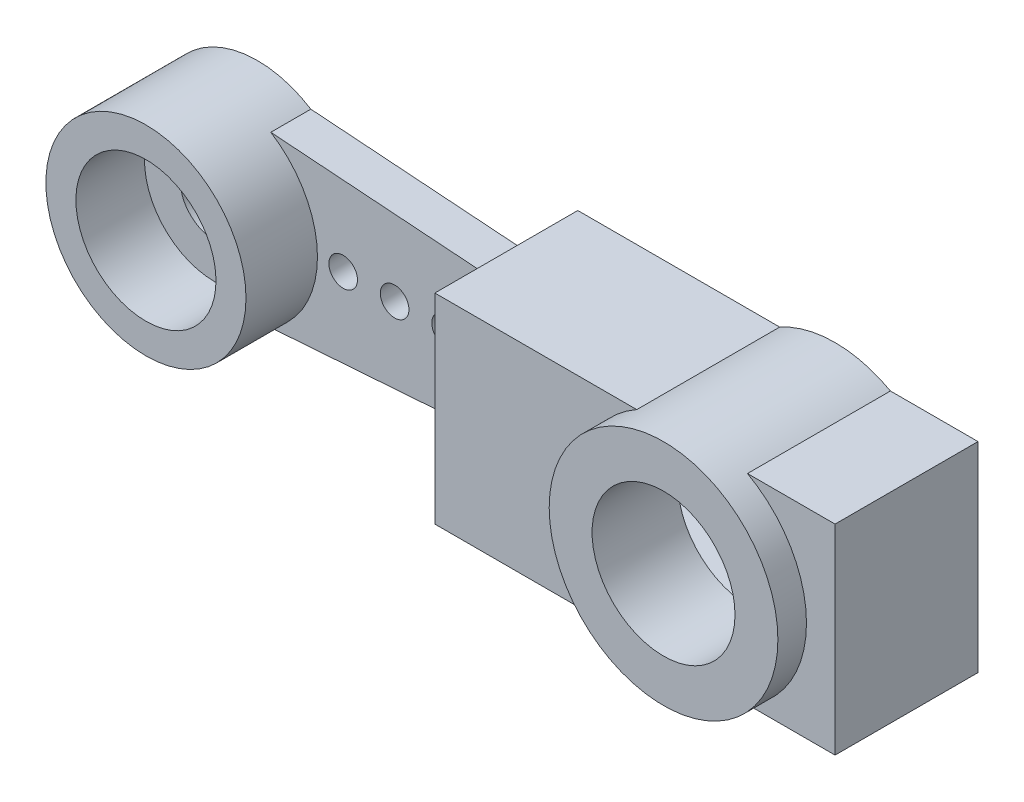
ISO-10303-21;
HEADER;
FILE_DESCRIPTION(('STEP AP214'),'2;1');
FILE_NAME('part.step','',(''),(''),'','','');
FILE_SCHEMA(('AUTOMOTIVE_DESIGN { 1 0 10303 214 1 1 1 1 }'));
ENDSEC;
DATA;
#1=APPLICATION_CONTEXT('core data for automotive mechanical design processes');
#2=APPLICATION_PROTOCOL_DEFINITION('international standard','automotive_design',2000,#1);
#3=PRODUCT_CONTEXT('',#1,'mechanical');
#4=PRODUCT('Part','Part','',(#3));
#5=PRODUCT_RELATED_PRODUCT_CATEGORY('part','',(#4));
#6=PRODUCT_DEFINITION_FORMATION('','',#4);
#7=PRODUCT_DEFINITION_CONTEXT('part definition',#1,'design');
#8=PRODUCT_DEFINITION('design','',#6,#7);
#9=PRODUCT_DEFINITION_SHAPE('','',#8);
#10=(LENGTH_UNIT() NAMED_UNIT(*) SI_UNIT(.MILLI.,.METRE.));
#11=(NAMED_UNIT(*) PLANE_ANGLE_UNIT() SI_UNIT($,.RADIAN.));
#12=(NAMED_UNIT(*) SI_UNIT($,.STERADIAN.) SOLID_ANGLE_UNIT());
#13=UNCERTAINTY_MEASURE_WITH_UNIT(LENGTH_MEASURE(1.E-05),#10,'distance_accuracy_value','');
#14=(GEOMETRIC_REPRESENTATION_CONTEXT(3) GLOBAL_UNCERTAINTY_ASSIGNED_CONTEXT((#13)) GLOBAL_UNIT_ASSIGNED_CONTEXT((#10,
#11,#12)) REPRESENTATION_CONTEXT('',''));
#15=CARTESIAN_POINT('',(0.,0.,0.));
#16=DIRECTION('',(0.,0.,1.));
#17=DIRECTION('',(1.,0.,0.));
#18=AXIS2_PLACEMENT_3D('',#15,#16,#17);
#19=CARTESIAN_POINT('',(13.5377556076663,7.66806747446083,7.8079032737814));
#20=DIRECTION('',(0.,0.,1.));
#21=DIRECTION('',(1.,0.,0.));
#22=AXIS2_PLACEMENT_3D('',#19,#20,#21);
#23=PLANE('',#22);
#24=DIRECTION('',(-1.,0.,0.));
#25=VECTOR('',#24,1.);
#26=CARTESIAN_POINT('',(13.5377556076663,5.16806747446083,7.8079032737814));
#27=LINE('',#26,#25);
#28=CARTESIAN_POINT('',(11.5377556076663,5.16806747446083,7.8079032737814));
#29=VERTEX_POINT('',#28);
#30=CARTESIAN_POINT('',(8.53775560766627,5.16806747446083,7.8079032737814));
#31=VERTEX_POINT('',#30);
#32=EDGE_CURVE('P0_E130',#29,#31,#27,.T.);
#33=ORIENTED_EDGE('',*,*,#32,.F.);
#34=DIRECTION('',(0.,1.,0.));
#35=VECTOR('',#34,1.);
#36=CARTESIAN_POINT('',(11.5377556076663,10.1680674744608,7.8079032737814));
#37=LINE('',#36,#35);
#38=CARTESIAN_POINT('',(11.5377556076663,10.1680674744608,7.8079032737814));
#39=VERTEX_POINT('',#38);
#40=EDGE_CURVE('P0_E129',#29,#39,#37,.T.);
#41=ORIENTED_EDGE('',*,*,#40,.T.);
#42=DIRECTION('',(-1.,0.,0.));
#43=VECTOR('',#42,1.);
#44=CARTESIAN_POINT('',(13.5377556076663,10.1680674744608,7.8079032737814));
#45=LINE('',#44,#43);
#46=CARTESIAN_POINT('',(8.53775560766627,10.1680674744608,7.8079032737814));
#47=VERTEX_POINT('',#46);
#48=EDGE_CURVE('P0_E116',#39,#47,#45,.T.);
#49=ORIENTED_EDGE('',*,*,#48,.T.);
#50=CARTESIAN_POINT('',(8.53775560766627,7.66806747446083,7.8079032737814));
#51=DIRECTION('',(0.,0.,-1.));
#52=DIRECTION('',(-1.,0.,0.));
#53=AXIS2_PLACEMENT_3D('',#50,#51,#52);
#54=CIRCLE('',#53,2.5);
#55=EDGE_CURVE('P0_E137',#31,#47,#54,.F.);
#56=ORIENTED_EDGE('',*,*,#55,.F.);
#57=EDGE_LOOP('',(#33,#41,#49,#56));
#58=FACE_BOUND('',#57,.T.);
#59=ADVANCED_FACE('P0_F16',(#58),#23,.T.);
#60=CARTESIAN_POINT('',(13.5377556076663,5.16806747446083,8.8079032737814));
#61=DIRECTION('',(0.,1.,0.));
#62=DIRECTION('',(0.,0.,1.));
#63=AXIS2_PLACEMENT_3D('',#60,#61,#62);
#64=PLANE('',#63);
#65=DIRECTION('',(-1.,0.,0.));
#66=VECTOR('',#65,1.);
#67=CARTESIAN_POINT('',(13.5377556076663,5.16806747446083,9.8079032737814));
#68=LINE('',#67,#66);
#69=CARTESIAN_POINT('',(11.5377556076663,5.16806747446083,9.8079032737814));
#70=VERTEX_POINT('',#69);
#71=CARTESIAN_POINT('',(8.53775560766627,5.16806747446083,9.8079032737814));
#72=VERTEX_POINT('',#71);
#73=EDGE_CURVE('P0_E217',#70,#72,#68,.T.);
#74=ORIENTED_EDGE('',*,*,#73,.F.);
#75=DIRECTION('',(0.,0.,-1.));
#76=VECTOR('',#75,1.);
#77=CARTESIAN_POINT('',(11.5377556076663,5.16806747446083,9.8079032737814));
#78=LINE('',#77,#76);
#79=EDGE_CURVE('P0_E30',#70,#29,#78,.T.);
#80=ORIENTED_EDGE('',*,*,#79,.T.);
#81=ORIENTED_EDGE('',*,*,#32,.T.);
#82=CARTESIAN_POINT('',(-0.46224439233373,5.16806747446083,7.8079032737814));
#83=VERTEX_POINT('',#82);
#84=EDGE_CURVE('P0_E219',#31,#83,#27,.T.);
#85=ORIENTED_EDGE('',*,*,#84,.T.);
#86=DIRECTION('',(0.,0.,-1.));
#87=VECTOR('',#86,1.);
#88=CARTESIAN_POINT('',(-0.46224439233373,5.16806747446083,8.8079032737814));
#89=LINE('',#88,#87);
#90=CARTESIAN_POINT('',(-0.46224439233373,5.16806747446083,9.8079032737814));
#91=VERTEX_POINT('',#90);
#92=EDGE_CURVE('P0_E178',#91,#83,#89,.T.);
#93=ORIENTED_EDGE('',*,*,#92,.F.);
#94=EDGE_CURVE('P0_E216',#72,#91,#68,.T.);
#95=ORIENTED_EDGE('',*,*,#94,.F.);
#96=EDGE_LOOP('',(#74,#80,#81,#85,#93,#95));
#97=FACE_BOUND('',#96,.T.);
#98=ADVANCED_FACE('P0_F274',(#97),#64,.T.);
#99=CARTESIAN_POINT('',(13.5377556076663,7.66806747446083,9.8079032737814));
#100=DIRECTION('',(0.,0.,1.));
#101=DIRECTION('',(1.,0.,0.));
#102=AXIS2_PLACEMENT_3D('',#99,#100,#101);
#103=PLANE('',#102);
#104=DIRECTION('',(0.,-1.,0.));
#105=VECTOR('',#104,1.);
#106=CARTESIAN_POINT('',(11.5377556076663,10.1680674744608,9.8079032737814));
#107=LINE('',#106,#105);
#108=CARTESIAN_POINT('',(11.5377556076663,10.1680674744608,9.8079032737814));
#109=VERTEX_POINT('',#108);
#110=EDGE_CURVE('P0_E38',#109,#70,#107,.T.);
#111=ORIENTED_EDGE('',*,*,#110,.T.);
#112=ORIENTED_EDGE('',*,*,#73,.T.);
#113=CARTESIAN_POINT('',(8.53775560766627,7.66806747446083,9.8079032737814));
#114=DIRECTION('',(0.,0.,1.));
#115=DIRECTION('',(1.,0.,0.));
#116=AXIS2_PLACEMENT_3D('',#113,#114,#115);
#117=CIRCLE('',#116,2.5);
#118=CARTESIAN_POINT('',(8.53775560766627,10.1680674744608,9.8079032737814));
#119=VERTEX_POINT('',#118);
#120=EDGE_CURVE('P0_E141',#119,#72,#117,.F.);
#121=ORIENTED_EDGE('',*,*,#120,.F.);
#122=DIRECTION('',(-1.,0.,0.));
#123=VECTOR('',#122,1.);
#124=CARTESIAN_POINT('',(13.5377556076663,10.1680674744608,9.8079032737814));
#125=LINE('',#124,#123);
#126=EDGE_CURVE('P0_E214',#109,#119,#125,.T.);
#127=ORIENTED_EDGE('',*,*,#126,.F.);
#128=EDGE_LOOP('',(#111,#112,#121,#127));
#129=FACE_BOUND('',#128,.T.);
#130=ADVANCED_FACE('P0_F279',(#129),#103,.F.);
#131=CARTESIAN_POINT('',(13.5377556076663,10.1680674744608,8.8079032737814));
#132=DIRECTION('',(0.,1.,0.));
#133=DIRECTION('',(0.,0.,1.));
#134=AXIS2_PLACEMENT_3D('',#131,#132,#133);
#135=PLANE('',#134);
#136=DIRECTION('',(0.,0.,1.));
#137=VECTOR('',#136,1.);
#138=CARTESIAN_POINT('',(11.5377556076663,10.1680674744608,9.8079032737814));
#139=LINE('',#138,#137);
#140=EDGE_CURVE('P0_E120',#39,#109,#139,.T.);
#141=ORIENTED_EDGE('',*,*,#140,.T.);
#142=ORIENTED_EDGE('',*,*,#126,.T.);
#143=CARTESIAN_POINT('',(-0.46224439233373,10.1680674744608,9.8079032737814));
#144=VERTEX_POINT('',#143);
#145=EDGE_CURVE('P0_E126',#119,#144,#125,.T.);
#146=ORIENTED_EDGE('',*,*,#145,.T.);
#147=DIRECTION('',(0.,0.,-1.));
#148=VECTOR('',#147,1.);
#149=CARTESIAN_POINT('',(-0.46224439233373,10.1680674744608,8.8079032737814));
#150=LINE('',#149,#148);
#151=CARTESIAN_POINT('',(-0.46224439233373,10.1680674744608,7.8079032737814));
#152=VERTEX_POINT('',#151);
#153=EDGE_CURVE('P0_E184',#144,#152,#150,.T.);
#154=ORIENTED_EDGE('',*,*,#153,.T.);
#155=EDGE_CURVE('P0_E122',#47,#152,#45,.T.);
#156=ORIENTED_EDGE('',*,*,#155,.F.);
#157=ORIENTED_EDGE('',*,*,#48,.F.);
#158=EDGE_LOOP('',(#141,#142,#146,#154,#156,#157));
#159=FACE_BOUND('',#158,.T.);
#160=ADVANCED_FACE('P0_F118',(#159),#135,.F.);
#161=CARTESIAN_POINT('',(8.53775560766627,7.66806747446083,-2.1920967262186));
#162=DIRECTION('',(0.,0.,1.));
#163=DIRECTION('',(1.,0.,0.));
#164=AXIS2_PLACEMENT_3D('',#161,#162,#163);
#165=CYLINDRICAL_SURFACE('',#164,2.5);
#166=EDGE_CURVE('P0_E134',#47,#31,#54,.F.);
#167=ORIENTED_EDGE('',*,*,#166,.T.);
#168=ORIENTED_EDGE('',*,*,#55,.T.);
#169=EDGE_LOOP('',(#167,#168));
#170=FACE_BOUND('',#169,.T.);
#171=CARTESIAN_POINT('',(8.53775560766627,7.66806747446083,7.3079032737814));
#172=DIRECTION('',(0.,0.,-1.));
#173=DIRECTION('',(-1.,0.,0.));
#174=AXIS2_PLACEMENT_3D('',#171,#172,#173);
#175=CIRCLE('',#174,2.5);
#176=CARTESIAN_POINT('',(6.03775560766627,7.66806747446083,7.3079032737814));
#177=VERTEX_POINT('',#176);
#178=EDGE_CURVE('P0_E11',#177,#177,#175,.F.);
#179=ORIENTED_EDGE('',*,*,#178,.F.);
#180=EDGE_LOOP('',(#179));
#181=FACE_BOUND('',#180,.T.);
#182=ADVANCED_FACE('P0_F294',(#170,#181),#165,.F.);
#183=CARTESIAN_POINT('',(8.53775560766627,7.66806747446083,12.8079032737814));
#184=DIRECTION('',(0.,0.,1.));
#185=DIRECTION('',(1.,0.,0.));
#186=AXIS2_PLACEMENT_3D('',#183,#184,#185);
#187=CIRCLE('',#186,2.5);
#188=CARTESIAN_POINT('',(11.0377556076663,7.66806747446083,12.8079032737814));
#189=VERTEX_POINT('',#188);
#190=EDGE_CURVE('P0_E145',#189,#189,#187,.T.);
#191=ORIENTED_EDGE('',*,*,#190,.T.);
#192=EDGE_LOOP('',(#191));
#193=FACE_BOUND('',#192,.T.);
#194=ORIENTED_EDGE('',*,*,#120,.T.);
#195=EDGE_CURVE('P0_E144',#72,#119,#117,.F.);
#196=ORIENTED_EDGE('',*,*,#195,.T.);
#197=EDGE_LOOP('',(#194,#196));
#198=FACE_BOUND('',#197,.T.);
#199=ADVANCED_FACE('P0_F297',(#193,#198),#165,.F.);
#200=CARTESIAN_POINT('',(13.5377556076663,4.16806747446083,8.8079032737814));
#201=DIRECTION('',(0.,1.,0.));
#202=DIRECTION('',(0.,0.,1.));
#203=AXIS2_PLACEMENT_3D('',#200,#201,#202);
#204=PLANE('',#203);
#205=DIRECTION('',(-1.,0.,0.));
#206=VECTOR('',#205,1.);
#207=CARTESIAN_POINT('',(13.5377556076663,4.16806747446083,6.8079032737814));
#208=LINE('',#207,#206);
#209=CARTESIAN_POINT('',(6.60126393456256,4.16806747446083,6.8079032737814));
#210=VERTEX_POINT('',#209);
#211=CARTESIAN_POINT('',(-0.46224439233373,4.16806747446083,6.8079032737814));
#212=VERTEX_POINT('',#211);
#213=EDGE_CURVE('P0_E209',#210,#212,#208,.T.);
#214=ORIENTED_EDGE('',*,*,#213,.F.);
#215=DIRECTION('',(0.,0.,1.));
#216=VECTOR('',#215,1.);
#217=CARTESIAN_POINT('',(6.60126393456256,4.16806747446083,6.8079032737814));
#218=LINE('',#217,#216);
#219=CARTESIAN_POINT('',(6.60126393456256,4.16806747446083,11.8079032737814));
#220=VERTEX_POINT('',#219);
#221=EDGE_CURVE('P0_E156',#210,#220,#218,.T.);
#222=ORIENTED_EDGE('',*,*,#221,.T.);
#223=DIRECTION('',(-1.,0.,0.));
#224=VECTOR('',#223,1.);
#225=CARTESIAN_POINT('',(13.5377556076663,4.16806747446083,11.8079032737814));
#226=LINE('',#225,#224);
#227=CARTESIAN_POINT('',(-0.46224439233373,4.16806747446083,11.8079032737814));
#228=VERTEX_POINT('',#227);
#229=EDGE_CURVE('P0_E201',#220,#228,#226,.T.);
#230=ORIENTED_EDGE('',*,*,#229,.T.);
#231=DIRECTION('',(0.,0.,-1.));
#232=VECTOR('',#231,1.);
#233=CARTESIAN_POINT('',(-0.46224439233373,4.16806747446083,8.8079032737814));
#234=LINE('',#233,#232);
#235=EDGE_CURVE('P0_E186',#228,#212,#234,.T.);
#236=ORIENTED_EDGE('',*,*,#235,.T.);
#237=EDGE_LOOP('',(#214,#222,#230,#236));
#238=FACE_BOUND('',#237,.T.);
#239=ADVANCED_FACE('P0_F254',(#238),#204,.F.);
#240=CARTESIAN_POINT('',(13.5377556076663,11.1680674744608,8.8079032737814));
#241=DIRECTION('',(0.,1.,0.));
#242=DIRECTION('',(0.,0.,1.));
#243=AXIS2_PLACEMENT_3D('',#240,#241,#242);
#244=PLANE('',#243);
#245=DIRECTION('',(0.,0.,1.));
#246=VECTOR('',#245,1.);
#247=CARTESIAN_POINT('',(6.60126393456256,11.1680674744608,6.8079032737814));
#248=LINE('',#247,#246);
#249=CARTESIAN_POINT('',(6.60126393456256,11.1680674744608,6.8079032737814));
#250=VERTEX_POINT('',#249);
#251=CARTESIAN_POINT('',(6.60126393456256,11.1680674744608,11.8079032737814));
#252=VERTEX_POINT('',#251);
#253=EDGE_CURVE('P0_E154',#250,#252,#248,.T.);
#254=ORIENTED_EDGE('',*,*,#253,.F.);
#255=DIRECTION('',(-1.,0.,0.));
#256=VECTOR('',#255,1.);
#257=CARTESIAN_POINT('',(13.5377556076663,11.1680674744608,6.8079032737814));
#258=LINE('',#257,#256);
#259=CARTESIAN_POINT('',(-0.46224439233373,11.1680674744608,6.8079032737814));
#260=VERTEX_POINT('',#259);
#261=EDGE_CURVE('P0_E205',#250,#260,#258,.T.);
#262=ORIENTED_EDGE('',*,*,#261,.T.);
#263=DIRECTION('',(0.,0.,-1.));
#264=VECTOR('',#263,1.);
#265=CARTESIAN_POINT('',(-0.46224439233373,11.1680674744608,8.8079032737814));
#266=LINE('',#265,#264);
#267=CARTESIAN_POINT('',(-0.46224439233373,11.1680674744608,11.8079032737814));
#268=VERTEX_POINT('',#267);
#269=EDGE_CURVE('P0_E192',#268,#260,#266,.T.);
#270=ORIENTED_EDGE('',*,*,#269,.F.);
#271=DIRECTION('',(-1.,0.,0.));
#272=VECTOR('',#271,1.);
#273=CARTESIAN_POINT('',(13.5377556076663,11.1680674744608,11.8079032737814));
#274=LINE('',#273,#272);
#275=EDGE_CURVE('P0_E200',#252,#268,#274,.T.);
#276=ORIENTED_EDGE('',*,*,#275,.F.);
#277=EDGE_LOOP('',(#254,#262,#270,#276));
#278=FACE_BOUND('',#277,.T.);
#279=ADVANCED_FACE('P0_F250',(#278),#244,.T.);
#280=CARTESIAN_POINT('',(13.5377556076663,7.66806747446083,11.8079032737814));
#281=DIRECTION('',(0.,0.,-1.));
#282=DIRECTION('',(0.,1.,0.));
#283=AXIS2_PLACEMENT_3D('',#280,#281,#282);
#284=PLANE('',#283);
#285=CARTESIAN_POINT('',(13.5377556076663,11.1680674744608,11.8079032737814));
#286=VERTEX_POINT('',#285);
#287=CARTESIAN_POINT('',(10.47424728077,11.1680674744608,11.8079032737814));
#288=VERTEX_POINT('',#287);
#289=EDGE_CURVE('P0_E202',#286,#288,#274,.T.);
#290=ORIENTED_EDGE('',*,*,#289,.T.);
#291=CARTESIAN_POINT('',(8.53775560766627,7.66806747446083,11.8079032737814));
#292=DIRECTION('',(0.,0.,-1.));
#293=DIRECTION('',(0.,1.,0.));
#294=AXIS2_PLACEMENT_3D('',#291,#292,#293);
#295=CIRCLE('',#294,4.);
#296=CARTESIAN_POINT('',(10.47424728077,4.16806747446083,11.8079032737814));
#297=VERTEX_POINT('',#296);
#298=EDGE_CURVE('P0_E23',#288,#297,#295,.T.);
#299=ORIENTED_EDGE('',*,*,#298,.T.);
#300=CARTESIAN_POINT('',(13.5377556076663,4.16806747446083,11.8079032737814));
#301=VERTEX_POINT('',#300);
#302=EDGE_CURVE('P0_E197',#301,#297,#226,.T.);
#303=ORIENTED_EDGE('',*,*,#302,.F.);
#304=DIRECTION('',(0.,-1.,0.));
#305=VECTOR('',#304,1.);
#306=CARTESIAN_POINT('',(13.5377556076663,7.66806747446083,11.8079032737814));
#307=LINE('',#306,#305);
#308=EDGE_CURVE('P0_E174',#286,#301,#307,.T.);
#309=ORIENTED_EDGE('',*,*,#308,.F.);
#310=EDGE_LOOP('',(#290,#299,#303,#309));
#311=FACE_BOUND('',#310,.T.);
#312=ADVANCED_FACE('P0_F227',(#311),#284,.F.);
#313=ORIENTED_EDGE('',*,*,#84,.F.);
#314=ORIENTED_EDGE('',*,*,#166,.F.);
#315=ORIENTED_EDGE('',*,*,#155,.T.);
#316=DIRECTION('',(0.,1.,0.));
#317=VECTOR('',#316,1.);
#318=CARTESIAN_POINT('',(-0.46224439233373,7.66806747446083,7.8079032737814));
#319=LINE('',#318,#317);
#320=EDGE_CURVE('P0_E164',#83,#152,#319,.T.);
#321=ORIENTED_EDGE('',*,*,#320,.F.);
#322=EDGE_LOOP('',(#313,#314,#315,#321));
#323=FACE_BOUND('',#322,.T.);
#324=ADVANCED_FACE('P0_F275',(#323),#23,.T.);
#325=ORIENTED_EDGE('',*,*,#145,.F.);
#326=ORIENTED_EDGE('',*,*,#195,.F.);
#327=ORIENTED_EDGE('',*,*,#94,.T.);
#328=DIRECTION('',(0.,1.,0.));
#329=VECTOR('',#328,1.);
#330=CARTESIAN_POINT('',(-0.46224439233373,7.66806747446083,9.8079032737814));
#331=LINE('',#330,#329);
#332=EDGE_CURVE('P0_E181',#91,#144,#331,.T.);
#333=ORIENTED_EDGE('',*,*,#332,.T.);
#334=EDGE_LOOP('',(#325,#326,#327,#333));
#335=FACE_BOUND('',#334,.T.);
#336=ADVANCED_FACE('P0_F281',(#335),#103,.F.);
#337=ORIENTED_EDGE('',*,*,#302,.T.);
#338=DIRECTION('',(0.,0.,1.));
#339=VECTOR('',#338,1.);
#340=CARTESIAN_POINT('',(10.47424728077,4.16806747446083,6.8079032737814));
#341=LINE('',#340,#339);
#342=CARTESIAN_POINT('',(10.47424728077,4.16806747446083,6.8079032737814));
#343=VERTEX_POINT('',#342);
#344=EDGE_CURVE('P0_E161',#297,#343,#341,.F.);
#345=ORIENTED_EDGE('',*,*,#344,.T.);
#346=CARTESIAN_POINT('',(13.5377556076663,4.16806747446083,6.8079032737814));
#347=VERTEX_POINT('',#346);
#348=EDGE_CURVE('P0_E210',#347,#343,#208,.T.);
#349=ORIENTED_EDGE('',*,*,#348,.F.);
#350=DIRECTION('',(0.,0.,-1.));
#351=VECTOR('',#350,1.);
#352=CARTESIAN_POINT('',(13.5377556076663,4.16806747446083,8.8079032737814));
#353=LINE('',#352,#351);
#354=EDGE_CURVE('P0_E165',#301,#347,#353,.T.);
#355=ORIENTED_EDGE('',*,*,#354,.F.);
#356=EDGE_LOOP('',(#337,#345,#349,#355));
#357=FACE_BOUND('',#356,.T.);
#358=ADVANCED_FACE('P0_F233',(#357),#204,.F.);
#359=CARTESIAN_POINT('',(13.5377556076663,7.66806747446083,6.8079032737814));
#360=DIRECTION('',(0.,0.,1.));
#361=DIRECTION('',(1.,0.,0.));
#362=AXIS2_PLACEMENT_3D('',#359,#360,#361);
#363=PLANE('',#362);
#364=ORIENTED_EDGE('',*,*,#348,.T.);
#365=CARTESIAN_POINT('',(8.53775560766627,7.66806747446083,6.8079032737814));
#366=DIRECTION('',(0.,0.,1.));
#367=DIRECTION('',(1.,0.,0.));
#368=AXIS2_PLACEMENT_3D('',#365,#366,#367);
#369=CIRCLE('',#368,4.);
#370=EDGE_CURVE('P0_E151',#210,#343,#369,.T.);
#371=ORIENTED_EDGE('',*,*,#370,.F.);
#372=ORIENTED_EDGE('',*,*,#213,.T.);
#373=DIRECTION('',(0.,1.,0.));
#374=VECTOR('',#373,1.);
#375=CARTESIAN_POINT('',(-0.46224439233373,7.66806747446083,6.8079032737814));
#376=LINE('',#375,#374);
#377=EDGE_CURVE('P0_E189',#212,#260,#376,.T.);
#378=ORIENTED_EDGE('',*,*,#377,.T.);
#379=ORIENTED_EDGE('',*,*,#261,.F.);
#380=CARTESIAN_POINT('',(10.47424728077,11.1680674744608,6.8079032737814));
#381=VERTEX_POINT('',#380);
#382=EDGE_CURVE('P0_E152',#381,#250,#369,.T.);
#383=ORIENTED_EDGE('',*,*,#382,.F.);
#384=CARTESIAN_POINT('',(13.5377556076663,11.1680674744608,6.8079032737814));
#385=VERTEX_POINT('',#384);
#386=EDGE_CURVE('P0_E206',#385,#381,#258,.T.);
#387=ORIENTED_EDGE('',*,*,#386,.F.);
#388=DIRECTION('',(0.,1.,0.));
#389=VECTOR('',#388,1.);
#390=CARTESIAN_POINT('',(13.5377556076663,7.66806747446083,6.8079032737814));
#391=LINE('',#390,#389);
#392=EDGE_CURVE('P0_E168',#347,#385,#391,.T.);
#393=ORIENTED_EDGE('',*,*,#392,.F.);
#394=EDGE_LOOP('',(#364,#371,#372,#378,#379,#383,#387,#393));
#395=FACE_BOUND('',#394,.T.);
#396=ADVANCED_FACE('P0_F246',(#395),#363,.F.);
#397=DIRECTION('',(0.,0.,1.));
#398=VECTOR('',#397,1.);
#399=CARTESIAN_POINT('',(10.47424728077,11.1680674744608,6.8079032737814));
#400=LINE('',#399,#398);
#401=EDGE_CURVE('P0_E159',#288,#381,#400,.F.);
#402=ORIENTED_EDGE('',*,*,#401,.F.);
#403=ORIENTED_EDGE('',*,*,#289,.F.);
#404=DIRECTION('',(0.,0.,-1.));
#405=VECTOR('',#404,1.);
#406=CARTESIAN_POINT('',(13.5377556076663,11.1680674744608,8.8079032737814));
#407=LINE('',#406,#405);
#408=EDGE_CURVE('P0_E171',#286,#385,#407,.T.);
#409=ORIENTED_EDGE('',*,*,#408,.T.);
#410=ORIENTED_EDGE('',*,*,#386,.T.);
#411=EDGE_LOOP('',(#402,#403,#409,#410));
#412=FACE_BOUND('',#411,.T.);
#413=ADVANCED_FACE('P0_F240',(#412),#244,.T.);
#414=ORIENTED_EDGE('',*,*,#229,.F.);
#415=EDGE_CURVE('P0_E212',#220,#252,#295,.T.);
#416=ORIENTED_EDGE('',*,*,#415,.T.);
#417=ORIENTED_EDGE('',*,*,#275,.T.);
#418=DIRECTION('',(0.,-1.,0.));
#419=VECTOR('',#418,1.);
#420=CARTESIAN_POINT('',(-0.46224439233373,7.66806747446083,11.8079032737814));
#421=LINE('',#420,#419);
#422=EDGE_CURVE('P0_E169',#268,#228,#421,.T.);
#423=ORIENTED_EDGE('',*,*,#422,.T.);
#424=EDGE_LOOP('',(#414,#416,#417,#423));
#425=FACE_BOUND('',#424,.T.);
#426=ADVANCED_FACE('P0_F255',(#425),#284,.F.);
#427=CARTESIAN_POINT('',(13.5377556076663,7.66806747446083,8.8079032737814));
#428=DIRECTION('',(1.,0.,0.));
#429=DIRECTION('',(0.,0.,-1.));
#430=AXIS2_PLACEMENT_3D('',#427,#428,#429);
#431=PLANE('',#430);
#432=ORIENTED_EDGE('',*,*,#354,.T.);
#433=ORIENTED_EDGE('',*,*,#392,.T.);
#434=ORIENTED_EDGE('',*,*,#408,.F.);
#435=ORIENTED_EDGE('',*,*,#308,.T.);
#436=EDGE_LOOP('',(#432,#433,#434,#435));
#437=FACE_BOUND('',#436,.T.);
#438=ADVANCED_FACE('P0_F236',(#437),#431,.T.);
#439=CARTESIAN_POINT('',(-0.46224439233373,7.66806747446083,8.8079032737814));
#440=DIRECTION('',(1.,0.,0.));
#441=DIRECTION('',(0.,0.,-1.));
#442=AXIS2_PLACEMENT_3D('',#439,#440,#441);
#443=PLANE('',#442);
#444=ORIENTED_EDGE('',*,*,#320,.T.);
#445=ORIENTED_EDGE('',*,*,#153,.F.);
#446=ORIENTED_EDGE('',*,*,#332,.F.);
#447=ORIENTED_EDGE('',*,*,#92,.T.);
#448=EDGE_LOOP('',(#444,#445,#446,#447));
#449=FACE_BOUND('',#448,.T.);
#450=ORIENTED_EDGE('',*,*,#235,.F.);
#451=ORIENTED_EDGE('',*,*,#422,.F.);
#452=ORIENTED_EDGE('',*,*,#269,.T.);
#453=ORIENTED_EDGE('',*,*,#377,.F.);
#454=EDGE_LOOP('',(#450,#451,#452,#453));
#455=FACE_BOUND('',#454,.T.);
#456=ADVANCED_FACE('P0_F259',(#449,#455),#443,.F.);
#457=CARTESIAN_POINT('',(8.53775560766627,7.66806747446083,12.8079032737814));
#458=DIRECTION('',(0.,0.,1.));
#459=DIRECTION('',(1.,0.,0.));
#460=AXIS2_PLACEMENT_3D('',#457,#458,#459);
#461=PLANE('',#460);
#462=CARTESIAN_POINT('',(8.53775560766627,7.66806747446083,12.8079032737814));
#463=DIRECTION('',(0.,0.,1.));
#464=DIRECTION('',(1.,0.,0.));
#465=AXIS2_PLACEMENT_3D('',#462,#463,#464);
#466=CIRCLE('',#465,4.);
#467=CARTESIAN_POINT('',(12.5377556076663,7.66806747446083,12.8079032737814));
#468=VERTEX_POINT('',#467);
#469=EDGE_CURVE('P0_E148',#468,#468,#466,.T.);
#470=ORIENTED_EDGE('',*,*,#469,.T.);
#471=EDGE_LOOP('',(#470));
#472=FACE_BOUND('',#471,.T.);
#473=ORIENTED_EDGE('',*,*,#190,.F.);
#474=EDGE_LOOP('',(#473));
#475=FACE_BOUND('',#474,.T.);
#476=ADVANCED_FACE('P0_F261',(#472,#475),#461,.T.);
#477=CARTESIAN_POINT('',(8.53775560766627,7.66806747446083,6.8079032737814));
#478=DIRECTION('',(0.,0.,1.));
#479=DIRECTION('',(1.,0.,0.));
#480=AXIS2_PLACEMENT_3D('',#477,#478,#479);
#481=CYLINDRICAL_SURFACE('',#480,4.);
#482=ORIENTED_EDGE('',*,*,#469,.F.);
#483=EDGE_LOOP('',(#482));
#484=FACE_BOUND('',#483,.T.);
#485=ORIENTED_EDGE('',*,*,#344,.F.);
#486=ORIENTED_EDGE('',*,*,#298,.F.);
#487=ORIENTED_EDGE('',*,*,#401,.T.);
#488=ORIENTED_EDGE('',*,*,#382,.T.);
#489=ORIENTED_EDGE('',*,*,#253,.T.);
#490=ORIENTED_EDGE('',*,*,#415,.F.);
#491=ORIENTED_EDGE('',*,*,#221,.F.);
#492=ORIENTED_EDGE('',*,*,#370,.T.);
#493=EDGE_LOOP('',(#485,#486,#487,#488,#489,#490,#491,#492));
#494=FACE_BOUND('',#493,.T.);
#495=ADVANCED_FACE('P0_F242',(#484,#494),#481,.T.);
#496=CARTESIAN_POINT('',(-0.46224439233373,7.66806747446083,7.3079032737814));
#497=DIRECTION('',(0.,0.,-1.));
#498=DIRECTION('',(-1.,0.,0.));
#499=AXIS2_PLACEMENT_3D('',#496,#497,#498);
#500=PLANE('',#499);
#501=ORIENTED_EDGE('',*,*,#178,.T.);
#502=EDGE_LOOP('',(#501));
#503=FACE_BOUND('',#502,.T.);
#504=ADVANCED_FACE('P0_F301',(#503),#500,.F.);
#505=CARTESIAN_POINT('',(11.5377556076663,7.66806747446083,8.8079032737814));
#506=DIRECTION('',(1.,0.,0.));
#507=DIRECTION('',(0.,0.,-1.));
#508=AXIS2_PLACEMENT_3D('',#505,#506,#507);
#509=PLANE('',#508);
#510=ORIENTED_EDGE('',*,*,#110,.F.);
#511=ORIENTED_EDGE('',*,*,#140,.F.);
#512=ORIENTED_EDGE('',*,*,#40,.F.);
#513=ORIENTED_EDGE('',*,*,#79,.F.);
#514=EDGE_LOOP('',(#510,#511,#512,#513));
#515=FACE_BOUND('',#514,.T.);
#516=ADVANCED_FACE('P0_F133',(#515),#509,.F.);
#517=CLOSED_SHELL('',(#59,#98,#130,#160,#182,#199,#239,#279,#312,#324,#336,#358,#396,#413,#426,
#438,#456,#476,#495,#504,#516));
#518=MANIFOLD_SOLID_BREP('P0_B1',#517);
#519=CARTESIAN_POINT('',(-25.8688437225807,7.60901792441629,9.20790327378107));
#520=DIRECTION('',(0.,0.,1.));
#521=DIRECTION('',(0.,-1.,0.));
#522=AXIS2_PLACEMENT_3D('',#519,#520,#521);
#523=PLANE('',#522);
#524=CARTESIAN_POINT('',(-4.46884372258066,7.60901792441653,9.20790327378137));
#525=DIRECTION('',(0.,0.,1.));
#526=DIRECTION('',(0.,-1.,0.));
#527=AXIS2_PLACEMENT_3D('',#524,#525,#526);
#528=CIRCLE('',#527,0.499999999999997);
#529=CARTESIAN_POINT('',(-4.46884372258066,7.10901792441653,9.20790327378137));
#530=VERTEX_POINT('',#529);
#531=EDGE_CURVE('P1_E112',#530,#530,#528,.T.);
#532=ORIENTED_EDGE('',*,*,#531,.F.);
#533=EDGE_LOOP('',(#532));
#534=FACE_BOUND('',#533,.T.);
#535=CARTESIAN_POINT('',(-0.868843722580663,7.60901792441661,9.20790327378142));
#536=DIRECTION('',(0.,0.,1.));
#537=DIRECTION('',(0.,-1.,0.));
#538=AXIS2_PLACEMENT_3D('',#535,#536,#537);
#539=CIRCLE('',#538,0.499999999999997);
#540=CARTESIAN_POINT('',(-0.868843722580656,7.10901792441661,9.20790327378142));
#541=VERTEX_POINT('',#540);
#542=EDGE_CURVE('P1_E124',#541,#541,#539,.T.);
#543=ORIENTED_EDGE('',*,*,#542,.F.);
#544=EDGE_LOOP('',(#543));
#545=FACE_BOUND('',#544,.T.);
#546=CARTESIAN_POINT('',(-2.66884372258066,7.60901792441657,9.20790327378139));
#547=DIRECTION('',(0.,0.,1.));
#548=DIRECTION('',(0.,-1.,0.));
#549=AXIS2_PLACEMENT_3D('',#546,#547,#548);
#550=CIRCLE('',#549,0.499999999999997);
#551=CARTESIAN_POINT('',(-2.66884372258066,7.10901792441657,9.20790327378139));
#552=VERTEX_POINT('',#551);
#553=EDGE_CURVE('P1_E118',#552,#552,#550,.T.);
#554=ORIENTED_EDGE('',*,*,#553,.F.);
#555=EDGE_LOOP('',(#554));
#556=FACE_BOUND('',#555,.T.);
#557=CARTESIAN_POINT('',(-6.26884372258066,7.60901792441649,9.20790327378134));
#558=DIRECTION('',(0.,0.,1.));
#559=DIRECTION('',(0.,-1.,0.));
#560=AXIS2_PLACEMENT_3D('',#557,#558,#559);
#561=CIRCLE('',#560,0.499999999999997);
#562=CARTESIAN_POINT('',(-6.26884372258066,7.1090179244165,9.20790327378134));
#563=VERTEX_POINT('',#562);
#564=EDGE_CURVE('P1_E106',#563,#563,#561,.T.);
#565=ORIENTED_EDGE('',*,*,#564,.F.);
#566=EDGE_LOOP('',(#565));
#567=FACE_BOUND('',#566,.T.);
#568=CARTESIAN_POINT('',(-10.6688437225807,7.6090179244165,9.20790327378128));
#569=DIRECTION('',(0.,0.,1.));
#570=DIRECTION('',(0.,-1.,0.));
#571=AXIS2_PLACEMENT_3D('',#568,#569,#570);
#572=CIRCLE('',#571,3.5);
#573=CARTESIAN_POINT('',(-8.80025900968168,4.64956000602668,9.2079032737813));
#574=VERTEX_POINT('',#573);
#575=CARTESIAN_POINT('',(-8.80025900968176,10.5684758428064,9.20790327378132));
#576=VERTEX_POINT('',#575);
#577=EDGE_CURVE('P1_E70',#574,#576,#572,.T.);
#578=ORIENTED_EDGE('',*,*,#577,.F.);
#579=DIRECTION('',(0.99742019887001,0.0717840294641436,0.));
#580=VECTOR('',#579,1.);
#581=CARTESIAN_POINT('',(-25.5689964553553,3.4427190534969,9.20790327378106));
#582=LINE('',#581,#580);
#583=CARTESIAN_POINT('',(0.33607320029822,5.30709906659354,9.20790327378143));
#584=VERTEX_POINT('',#583);
#585=EDGE_CURVE('P1_E86',#574,#584,#582,.T.);
#586=ORIENTED_EDGE('',*,*,#585,.T.);
#587=DIRECTION('',(0.,1.,0.));
#588=VECTOR('',#587,1.);
#589=CARTESIAN_POINT('',(0.336073200298152,10.0857319104532,9.20790327378144));
#590=LINE('',#589,#588);
#591=CARTESIAN_POINT('',(0.336073200298154,9.91093678223977,9.20790327378144));
#592=VERTEX_POINT('',#591);
#593=EDGE_CURVE('P1_E24',#584,#592,#590,.T.);
#594=ORIENTED_EDGE('',*,*,#593,.T.);
#595=DIRECTION('',(-0.997420198870012,0.0717840294641156,0.));
#596=VECTOR('',#595,1.);
#597=CARTESIAN_POINT('',(-25.5689964553555,11.7753167953357,9.20790327378109));
#598=LINE('',#597,#596);
#599=EDGE_CURVE('P1_E83',#592,#576,#598,.T.);
#600=ORIENTED_EDGE('',*,*,#599,.T.);
#601=EDGE_LOOP('',(#578,#586,#594,#600));
#602=FACE_BOUND('',#601,.T.);
#603=ADVANCED_FACE('P1_F16',(#534,#545,#556,#567,#602),#523,.T.);
#604=CARTESIAN_POINT('',(-25.8688437225806,7.60901792441629,7.80790327378107));
#605=DIRECTION('',(0.,0.,1.));
#606=DIRECTION('',(0.,-1.,0.));
#607=AXIS2_PLACEMENT_3D('',#604,#605,#606);
#608=PLANE('',#607);
#609=CARTESIAN_POINT('',(-10.6688437225806,7.6090179244165,7.80790327378128));
#610=DIRECTION('',(0.,0.,-1.));
#611=DIRECTION('',(0.,1.,0.));
#612=AXIS2_PLACEMENT_3D('',#609,#610,#611);
#613=CIRCLE('',#612,2.35);
#614=CARTESIAN_POINT('',(-10.6688437225807,9.95901792441651,7.80790327378129));
#615=VERTEX_POINT('',#614);
#616=EDGE_CURVE('P1_E98',#615,#615,#613,.T.);
#617=ORIENTED_EDGE('',*,*,#616,.F.);
#618=EDGE_LOOP('',(#617));
#619=FACE_BOUND('',#618,.T.);
#620=CARTESIAN_POINT('',(-0.868843722580644,7.60901792441661,7.80790327378142));
#621=DIRECTION('',(0.,0.,1.));
#622=DIRECTION('',(0.,-1.,0.));
#623=AXIS2_PLACEMENT_3D('',#620,#621,#622);
#624=CIRCLE('',#623,0.499999999999997);
#625=CARTESIAN_POINT('',(-0.868843722580637,7.10901792441661,7.80790327378142));
#626=VERTEX_POINT('',#625);
#627=EDGE_CURVE('P1_E121',#626,#626,#624,.T.);
#628=ORIENTED_EDGE('',*,*,#627,.T.);
#629=EDGE_LOOP('',(#628));
#630=FACE_BOUND('',#629,.T.);
#631=CARTESIAN_POINT('',(-2.66884372258064,7.60901792441657,7.80790327378139));
#632=DIRECTION('',(0.,0.,1.));
#633=DIRECTION('',(0.,-1.,0.));
#634=AXIS2_PLACEMENT_3D('',#631,#632,#633);
#635=CIRCLE('',#634,0.499999999999997);
#636=CARTESIAN_POINT('',(-2.66884372258064,7.10901792441658,7.80790327378139));
#637=VERTEX_POINT('',#636);
#638=EDGE_CURVE('P1_E115',#637,#637,#635,.T.);
#639=ORIENTED_EDGE('',*,*,#638,.T.);
#640=EDGE_LOOP('',(#639));
#641=FACE_BOUND('',#640,.T.);
#642=CARTESIAN_POINT('',(-4.46884372258064,7.60901792441654,7.80790327378137));
#643=DIRECTION('',(0.,0.,1.));
#644=DIRECTION('',(0.,-1.,0.));
#645=AXIS2_PLACEMENT_3D('',#642,#643,#644);
#646=CIRCLE('',#645,0.499999999999997);
#647=CARTESIAN_POINT('',(-4.46884372258064,7.10901792441654,7.80790327378137));
#648=VERTEX_POINT('',#647);
#649=EDGE_CURVE('P1_E109',#648,#648,#646,.T.);
#650=ORIENTED_EDGE('',*,*,#649,.T.);
#651=EDGE_LOOP('',(#650));
#652=FACE_BOUND('',#651,.T.);
#653=CARTESIAN_POINT('',(-6.26884372258064,7.6090179244165,7.80790327378134));
#654=DIRECTION('',(0.,0.,1.));
#655=DIRECTION('',(0.,-1.,0.));
#656=AXIS2_PLACEMENT_3D('',#653,#654,#655);
#657=CIRCLE('',#656,0.499999999999997);
#658=CARTESIAN_POINT('',(-6.26884372258064,7.1090179244165,7.80790327378134));
#659=VERTEX_POINT('',#658);
#660=EDGE_CURVE('P1_E103',#659,#659,#657,.T.);
#661=ORIENTED_EDGE('',*,*,#660,.T.);
#662=EDGE_LOOP('',(#661));
#663=FACE_BOUND('',#662,.T.);
#664=CARTESIAN_POINT('',(-10.6688437225806,7.6090179244165,7.80790327378128));
#665=DIRECTION('',(0.,0.,-1.));
#666=DIRECTION('',(0.,1.,0.));
#667=AXIS2_PLACEMENT_3D('',#664,#665,#666);
#668=CIRCLE('',#667,3.5);
#669=CARTESIAN_POINT('',(-8.80025900968166,4.64956000602668,7.8079032737813));
#670=VERTEX_POINT('',#669);
#671=CARTESIAN_POINT('',(-8.80025900968174,10.5684758428064,7.80790327378132));
#672=VERTEX_POINT('',#671);
#673=EDGE_CURVE('P1_E55',#670,#672,#668,.T.);
#674=ORIENTED_EDGE('',*,*,#673,.T.);
#675=DIRECTION('',(0.997420198870012,-0.0717840294641156,0.));
#676=VECTOR('',#675,1.);
#677=CARTESIAN_POINT('',(-8.80025900968174,10.5684758428064,7.80790327378132));
#678=LINE('',#677,#676);
#679=CARTESIAN_POINT('',(0.336073200298175,9.91093678223977,7.80790327378144));
#680=VERTEX_POINT('',#679);
#681=EDGE_CURVE('P1_E60',#672,#680,#678,.T.);
#682=ORIENTED_EDGE('',*,*,#681,.T.);
#683=DIRECTION('',(0.,1.,0.));
#684=VECTOR('',#683,1.);
#685=CARTESIAN_POINT('',(0.336073200298171,10.0857319104532,7.80790327378144));
#686=LINE('',#685,#684);
#687=CARTESIAN_POINT('',(0.336073200298239,5.30709906659355,7.80790327378143));
#688=VERTEX_POINT('',#687);
#689=EDGE_CURVE('P1_E127',#688,#680,#686,.T.);
#690=ORIENTED_EDGE('',*,*,#689,.F.);
#691=DIRECTION('',(-0.99742019887001,-0.0717840294641436,0.));
#692=VECTOR('',#691,1.);
#693=CARTESIAN_POINT('',(4.53115627741939,5.60901792441672,7.80790327378149));
#694=LINE('',#693,#692);
#695=EDGE_CURVE('P1_E31',#688,#670,#694,.T.);
#696=ORIENTED_EDGE('',*,*,#695,.T.);
#697=EDGE_LOOP('',(#674,#682,#690,#696));
#698=FACE_BOUND('',#697,.T.);
#699=ADVANCED_FACE('P1_F57',(#619,#630,#641,#652,#663,#698),#608,.F.);
#700=CARTESIAN_POINT('',(0.336073200298152,10.0857319104532,9.20790327378144));
#701=DIRECTION('',(-1.,0.,0.));
#702=DIRECTION('',(0.,-1.,0.));
#703=AXIS2_PLACEMENT_3D('',#700,#701,#702);
#704=PLANE('',#703);
#705=DIRECTION('',(0.,0.,1.));
#706=VECTOR('',#705,1.);
#707=CARTESIAN_POINT('',(0.33607320029822,5.30709906659354,9.20790327378143));
#708=LINE('',#707,#706);
#709=EDGE_CURVE('P1_E35',#688,#584,#708,.T.);
#710=ORIENTED_EDGE('',*,*,#709,.F.);
#711=ORIENTED_EDGE('',*,*,#689,.T.);
#712=DIRECTION('',(0.,0.,-1.));
#713=VECTOR('',#712,1.);
#714=CARTESIAN_POINT('',(0.336073200298154,9.91093678223977,9.20790327378144));
#715=LINE('',#714,#713);
#716=EDGE_CURVE('P1_E77',#592,#680,#715,.T.);
#717=ORIENTED_EDGE('',*,*,#716,.F.);
#718=ORIENTED_EDGE('',*,*,#593,.F.);
#719=EDGE_LOOP('',(#710,#711,#717,#718));
#720=FACE_BOUND('',#719,.T.);
#721=ADVANCED_FACE('P1_F18',(#720),#704,.F.);
#722=CARTESIAN_POINT('',(-0.868843722580663,7.60901792441661,9.20790327378142));
#723=DIRECTION('',(0.,0.,-1.));
#724=DIRECTION('',(0.,1.,0.));
#725=AXIS2_PLACEMENT_3D('',#722,#723,#724);
#726=CYLINDRICAL_SURFACE('',#725,0.499999999999997);
#727=ORIENTED_EDGE('',*,*,#542,.T.);
#728=EDGE_LOOP('',(#727));
#729=FACE_BOUND('',#728,.T.);
#730=ORIENTED_EDGE('',*,*,#627,.F.);
#731=EDGE_LOOP('',(#730));
#732=FACE_BOUND('',#731,.T.);
#733=ADVANCED_FACE('P1_F181',(#729,#732),#726,.F.);
#734=CARTESIAN_POINT('',(-2.66884372258066,7.60901792441657,9.20790327378139));
#735=DIRECTION('',(0.,0.,-1.));
#736=DIRECTION('',(0.,1.,0.));
#737=AXIS2_PLACEMENT_3D('',#734,#735,#736);
#738=CYLINDRICAL_SURFACE('',#737,0.499999999999997);
#739=ORIENTED_EDGE('',*,*,#553,.T.);
#740=EDGE_LOOP('',(#739));
#741=FACE_BOUND('',#740,.T.);
#742=ORIENTED_EDGE('',*,*,#638,.F.);
#743=EDGE_LOOP('',(#742));
#744=FACE_BOUND('',#743,.T.);
#745=ADVANCED_FACE('P1_F170',(#741,#744),#738,.F.);
#746=CARTESIAN_POINT('',(-4.46884372258066,7.60901792441653,9.20790327378137));
#747=DIRECTION('',(0.,0.,-1.));
#748=DIRECTION('',(0.,1.,0.));
#749=AXIS2_PLACEMENT_3D('',#746,#747,#748);
#750=CYLINDRICAL_SURFACE('',#749,0.499999999999997);
#751=ORIENTED_EDGE('',*,*,#531,.T.);
#752=EDGE_LOOP('',(#751));
#753=FACE_BOUND('',#752,.T.);
#754=ORIENTED_EDGE('',*,*,#649,.F.);
#755=EDGE_LOOP('',(#754));
#756=FACE_BOUND('',#755,.T.);
#757=ADVANCED_FACE('P1_F163',(#753,#756),#750,.F.);
#758=CARTESIAN_POINT('',(-6.26884372258066,7.60901792441649,9.20790327378134));
#759=DIRECTION('',(0.,0.,-1.));
#760=DIRECTION('',(0.,1.,0.));
#761=AXIS2_PLACEMENT_3D('',#758,#759,#760);
#762=CYLINDRICAL_SURFACE('',#761,0.499999999999997);
#763=ORIENTED_EDGE('',*,*,#564,.T.);
#764=EDGE_LOOP('',(#763));
#765=FACE_BOUND('',#764,.T.);
#766=ORIENTED_EDGE('',*,*,#660,.F.);
#767=EDGE_LOOP('',(#766));
#768=FACE_BOUND('',#767,.T.);
#769=ADVANCED_FACE('P1_F148',(#765,#768),#762,.F.);
#770=CARTESIAN_POINT('',(-10.6688437225807,7.6090179244165,8.80790327378128));
#771=DIRECTION('',(0.,0.,-1.));
#772=DIRECTION('',(0.,1.,0.));
#773=AXIS2_PLACEMENT_3D('',#770,#771,#772);
#774=CYLINDRICAL_SURFACE('',#773,2.35);
#775=CARTESIAN_POINT('',(-10.6688437225807,7.6090179244165,8.80790327378128));
#776=DIRECTION('',(0.,0.,-1.));
#777=DIRECTION('',(0.,1.,0.));
#778=AXIS2_PLACEMENT_3D('',#775,#776,#777);
#779=CIRCLE('',#778,2.35);
#780=CARTESIAN_POINT('',(-10.6688437225807,9.9590179244165,8.80790327378129));
#781=VERTEX_POINT('',#780);
#782=EDGE_CURVE('P1_E100',#781,#781,#779,.T.);
#783=ORIENTED_EDGE('',*,*,#782,.F.);
#784=EDGE_LOOP('',(#783));
#785=FACE_BOUND('',#784,.T.);
#786=ORIENTED_EDGE('',*,*,#616,.T.);
#787=EDGE_LOOP('',(#786));
#788=FACE_BOUND('',#787,.T.);
#789=ADVANCED_FACE('P1_F142',(#785,#788),#774,.F.);
#790=CARTESIAN_POINT('',(-10.6688437225807,7.6090179244165,8.80790327378128));
#791=DIRECTION('',(0.,0.,-1.));
#792=DIRECTION('',(0.,1.,0.));
#793=AXIS2_PLACEMENT_3D('',#790,#791,#792);
#794=PLANE('',#793);
#795=CARTESIAN_POINT('',(-10.6688437225807,7.6090179244165,8.80790327378128));
#796=DIRECTION('',(0.,0.,-1.));
#797=DIRECTION('',(0.,1.,0.));
#798=AXIS2_PLACEMENT_3D('',#795,#796,#797);
#799=CIRCLE('',#798,1.2);
#800=CARTESIAN_POINT('',(-10.6688437225807,8.8090179244165,8.80790327378129));
#801=VERTEX_POINT('',#800);
#802=EDGE_CURVE('P1_E91',#801,#801,#799,.T.);
#803=ORIENTED_EDGE('',*,*,#802,.F.);
#804=EDGE_LOOP('',(#803));
#805=FACE_BOUND('',#804,.T.);
#806=ORIENTED_EDGE('',*,*,#782,.T.);
#807=EDGE_LOOP('',(#806));
#808=FACE_BOUND('',#807,.T.);
#809=ADVANCED_FACE('P1_F138',(#805,#808),#794,.T.);
#810=CARTESIAN_POINT('',(-10.6688437225807,7.60901792441649,11.7079032737813));
#811=DIRECTION('',(0.,0.,1.));
#812=DIRECTION('',(0.,-1.,0.));
#813=AXIS2_PLACEMENT_3D('',#810,#811,#812);
#814=PLANE('',#813);
#815=CARTESIAN_POINT('',(-10.6688437225807,7.60901792441649,11.7079032737813));
#816=DIRECTION('',(0.,0.,1.));
#817=DIRECTION('',(0.,-1.,0.));
#818=AXIS2_PLACEMENT_3D('',#815,#816,#817);
#819=CIRCLE('',#818,3.5);
#820=CARTESIAN_POINT('',(-10.6688437225806,4.10901792441649,11.7079032737813));
#821=VERTEX_POINT('',#820);
#822=EDGE_CURVE('P1_E95',#821,#821,#819,.T.);
#823=ORIENTED_EDGE('',*,*,#822,.T.);
#824=EDGE_LOOP('',(#823));
#825=FACE_BOUND('',#824,.T.);
#826=CARTESIAN_POINT('',(-10.6688437225807,7.60901792441649,11.7079032737813));
#827=DIRECTION('',(0.,0.,1.));
#828=DIRECTION('',(0.,-1.,0.));
#829=AXIS2_PLACEMENT_3D('',#826,#827,#828);
#830=CIRCLE('',#829,2.45);
#831=CARTESIAN_POINT('',(-10.6688437225807,5.15901792441649,11.7079032737813));
#832=VERTEX_POINT('',#831);
#833=EDGE_CURVE('P1_E92',#832,#832,#830,.T.);
#834=ORIENTED_EDGE('',*,*,#833,.F.);
#835=EDGE_LOOP('',(#834));
#836=FACE_BOUND('',#835,.T.);
#837=ADVANCED_FACE('P1_F141',(#825,#836),#814,.T.);
#838=CARTESIAN_POINT('',(-10.6688437225807,7.60901792441649,11.7079032737813));
#839=DIRECTION('',(0.,0.,-1.));
#840=DIRECTION('',(0.,1.,0.));
#841=AXIS2_PLACEMENT_3D('',#838,#839,#840);
#842=CYLINDRICAL_SURFACE('',#841,3.5);
#843=DIRECTION('',(0.,0.,-1.));
#844=VECTOR('',#843,1.);
#845=CARTESIAN_POINT('',(-8.80025900968179,10.5684758428064,11.7079032737813));
#846=LINE('',#845,#844);
#847=EDGE_CURVE('P1_E64',#576,#672,#846,.T.);
#848=ORIENTED_EDGE('',*,*,#847,.T.);
#849=ORIENTED_EDGE('',*,*,#673,.F.);
#850=DIRECTION('',(0.,0.,-1.));
#851=VECTOR('',#850,1.);
#852=CARTESIAN_POINT('',(-8.80025900968171,4.64956000602667,11.7079032737813));
#853=LINE('',#852,#851);
#854=EDGE_CURVE('P1_E73',#574,#670,#853,.T.);
#855=ORIENTED_EDGE('',*,*,#854,.F.);
#856=ORIENTED_EDGE('',*,*,#577,.T.);
#857=EDGE_LOOP('',(#848,#849,#855,#856));
#858=FACE_BOUND('',#857,.T.);
#859=ORIENTED_EDGE('',*,*,#822,.F.);
#860=EDGE_LOOP('',(#859));
#861=FACE_BOUND('',#860,.T.);
#862=ADVANCED_FACE('P1_F67',(#858,#861),#842,.T.);
#863=CARTESIAN_POINT('',(-10.6688437225807,7.60901792441649,11.7079032737813));
#864=DIRECTION('',(0.,0.,-1.));
#865=DIRECTION('',(0.,1.,0.));
#866=AXIS2_PLACEMENT_3D('',#863,#864,#865);
#867=CYLINDRICAL_SURFACE('',#866,2.45);
#868=CARTESIAN_POINT('',(-10.6688437225807,7.6090179244165,9.30790327378128));
#869=DIRECTION('',(0.,0.,1.));
#870=DIRECTION('',(0.,-1.,0.));
#871=AXIS2_PLACEMENT_3D('',#868,#869,#870);
#872=CIRCLE('',#871,2.45);
#873=CARTESIAN_POINT('',(-10.6688437225806,5.1590179244165,9.30790327378127));
#874=VERTEX_POINT('',#873);
#875=EDGE_CURVE('P1_E11',#874,#874,#872,.T.);
#876=ORIENTED_EDGE('',*,*,#875,.F.);
#877=EDGE_LOOP('',(#876));
#878=FACE_BOUND('',#877,.T.);
#879=ORIENTED_EDGE('',*,*,#833,.T.);
#880=EDGE_LOOP('',(#879));
#881=FACE_BOUND('',#880,.T.);
#882=ADVANCED_FACE('P1_F255',(#878,#881),#867,.F.);
#883=CARTESIAN_POINT('',(-10.6688437225806,7.6090179244165,7.80790327378128));
#884=DIRECTION('',(0.,0.,1.));
#885=DIRECTION('',(0.,-1.,0.));
#886=AXIS2_PLACEMENT_3D('',#883,#884,#885);
#887=CYLINDRICAL_SURFACE('',#886,1.2);
#888=ORIENTED_EDGE('',*,*,#802,.T.);
#889=EDGE_LOOP('',(#888));
#890=FACE_BOUND('',#889,.T.);
#891=CARTESIAN_POINT('',(-10.6688437225807,7.6090179244165,9.30790327378128));
#892=DIRECTION('',(0.,0.,1.));
#893=DIRECTION('',(0.,-1.,0.));
#894=AXIS2_PLACEMENT_3D('',#891,#892,#893);
#895=CIRCLE('',#894,1.2);
#896=CARTESIAN_POINT('',(-10.6688437225806,6.4090179244165,9.30790327378128));
#897=VERTEX_POINT('',#896);
#898=EDGE_CURVE('P1_E88',#897,#897,#895,.T.);
#899=ORIENTED_EDGE('',*,*,#898,.T.);
#900=EDGE_LOOP('',(#899));
#901=FACE_BOUND('',#900,.T.);
#902=ADVANCED_FACE('P1_F135',(#890,#901),#887,.F.);
#903=CARTESIAN_POINT('',(-10.6688437225807,7.6090179244165,9.30790327378128));
#904=DIRECTION('',(0.,0.,1.));
#905=DIRECTION('',(0.,-1.,0.));
#906=AXIS2_PLACEMENT_3D('',#903,#904,#905);
#907=PLANE('',#906);
#908=ORIENTED_EDGE('',*,*,#875,.T.);
#909=EDGE_LOOP('',(#908));
#910=FACE_BOUND('',#909,.T.);
#911=ORIENTED_EDGE('',*,*,#898,.F.);
#912=EDGE_LOOP('',(#911));
#913=FACE_BOUND('',#912,.T.);
#914=ADVANCED_FACE('P1_F273',(#910,#913),#907,.T.);
#915=CARTESIAN_POINT('',(-8.80025900968179,10.5684758428064,11.7079032737813));
#916=DIRECTION('',(0.0717840294641156,0.997420198870012,0.));
#917=DIRECTION('',(-0.997420198870012,0.0717840294641156,0.));
#918=AXIS2_PLACEMENT_3D('',#915,#916,#917);
#919=PLANE('',#918);
#920=ORIENTED_EDGE('',*,*,#716,.T.);
#921=ORIENTED_EDGE('',*,*,#681,.F.);
#922=ORIENTED_EDGE('',*,*,#847,.F.);
#923=ORIENTED_EDGE('',*,*,#599,.F.);
#924=EDGE_LOOP('',(#920,#921,#922,#923));
#925=FACE_BOUND('',#924,.T.);
#926=ADVANCED_FACE('P1_F75',(#925),#919,.T.);
#927=CARTESIAN_POINT('',(4.53115627741933,5.6090179244167,11.7079032737815));
#928=DIRECTION('',(0.0717840294641436,-0.99742019887001,0.));
#929=DIRECTION('',(0.99742019887001,0.0717840294641436,0.));
#930=AXIS2_PLACEMENT_3D('',#927,#928,#929);
#931=PLANE('',#930);
#932=ORIENTED_EDGE('',*,*,#854,.T.);
#933=ORIENTED_EDGE('',*,*,#695,.F.);
#934=ORIENTED_EDGE('',*,*,#709,.T.);
#935=ORIENTED_EDGE('',*,*,#585,.F.);
#936=EDGE_LOOP('',(#932,#933,#934,#935));
#937=FACE_BOUND('',#936,.T.);
#938=ADVANCED_FACE('P1_F291',(#937),#931,.T.);
#939=CLOSED_SHELL('',(#603,#699,#721,#733,#745,#757,#769,#789,#809,#837,#862,#882,#902,#914,
#926,#938));
#940=MANIFOLD_SOLID_BREP('P1_B1',#939);
#941=ADVANCED_BREP_SHAPE_REPRESENTATION('',(#18,#518,#940),#14);
#942=SHAPE_DEFINITION_REPRESENTATION(#9,#941);
ENDSEC;
END-ISO-10303-21;
